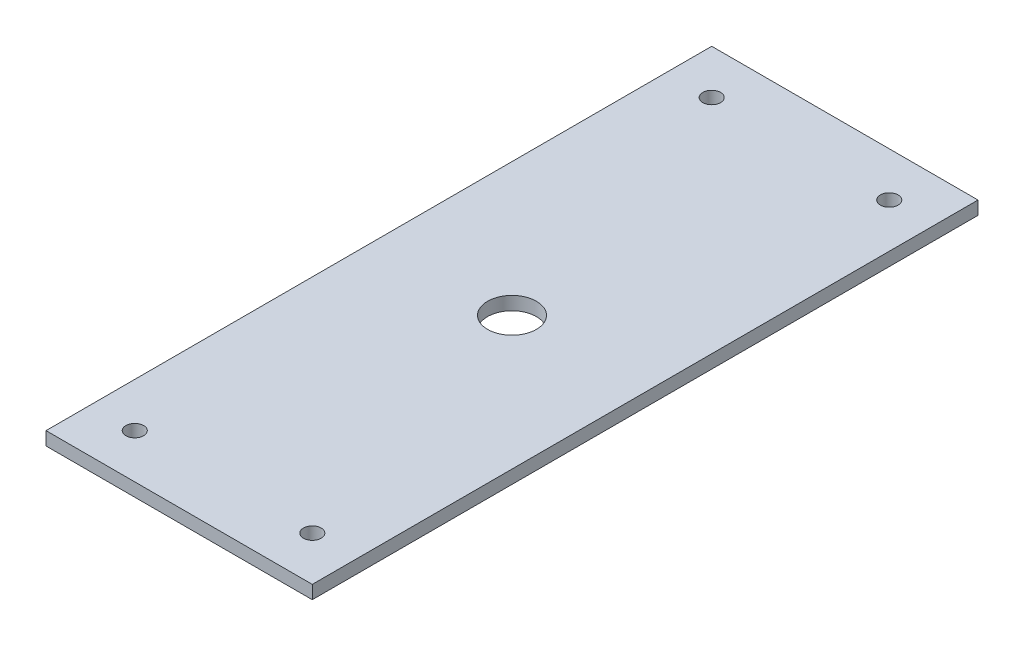
ISO-10303-21;
HEADER;
FILE_DESCRIPTION(('STEP AP214'),'2;1');
FILE_NAME('part.step','',(''),(''),'','','');
FILE_SCHEMA(('AUTOMOTIVE_DESIGN { 1 0 10303 214 1 1 1 1 }'));
ENDSEC;
DATA;
#1=APPLICATION_CONTEXT('core data for automotive mechanical design processes');
#2=APPLICATION_PROTOCOL_DEFINITION('international standard','automotive_design',2000,#1);
#3=PRODUCT_CONTEXT('',#1,'mechanical');
#4=PRODUCT('Part','Part','',(#3));
#5=PRODUCT_RELATED_PRODUCT_CATEGORY('part','',(#4));
#6=PRODUCT_DEFINITION_FORMATION('','',#4);
#7=PRODUCT_DEFINITION_CONTEXT('part definition',#1,'design');
#8=PRODUCT_DEFINITION('design','',#6,#7);
#9=PRODUCT_DEFINITION_SHAPE('','',#8);
#10=(LENGTH_UNIT() NAMED_UNIT(*) SI_UNIT(.MILLI.,.METRE.));
#11=(NAMED_UNIT(*) PLANE_ANGLE_UNIT() SI_UNIT($,.RADIAN.));
#12=(NAMED_UNIT(*) SI_UNIT($,.STERADIAN.) SOLID_ANGLE_UNIT());
#13=UNCERTAINTY_MEASURE_WITH_UNIT(LENGTH_MEASURE(1.E-05),#10,'distance_accuracy_value','');
#14=(GEOMETRIC_REPRESENTATION_CONTEXT(3) GLOBAL_UNCERTAINTY_ASSIGNED_CONTEXT((#13)) GLOBAL_UNIT_ASSIGNED_CONTEXT((#10,
#11,#12)) REPRESENTATION_CONTEXT('',''));
#15=CARTESIAN_POINT('',(0.,0.,0.));
#16=DIRECTION('',(0.,0.,1.));
#17=DIRECTION('',(1.,0.,0.));
#18=AXIS2_PLACEMENT_3D('',#15,#16,#17);
#19=CARTESIAN_POINT('',(0.,6.,-150.));
#20=DIRECTION('',(0.,0.,1.));
#21=DIRECTION('',(1.,0.,0.));
#22=AXIS2_PLACEMENT_3D('',#19,#20,#21);
#23=PLANE('',#22);
#24=DIRECTION('',(-1.,0.,0.));
#25=VECTOR('',#24,1.);
#26=CARTESIAN_POINT('',(0.,0.,-150.));
#27=LINE('',#26,#25);
#28=CARTESIAN_POINT('',(60.,0.,-150.));
#29=VERTEX_POINT('',#28);
#30=CARTESIAN_POINT('',(-60.,0.,-150.));
#31=VERTEX_POINT('',#30);
#32=EDGE_CURVE('E118',#29,#31,#27,.T.);
#33=ORIENTED_EDGE('',*,*,#32,.T.);
#34=DIRECTION('',(0.,-1.,0.));
#35=VECTOR('',#34,1.);
#36=CARTESIAN_POINT('',(-60.,6.,-150.));
#37=LINE('',#36,#35);
#38=CARTESIAN_POINT('',(-60.,6.,-150.));
#39=VERTEX_POINT('',#38);
#40=EDGE_CURVE('E11',#39,#31,#37,.T.);
#41=ORIENTED_EDGE('',*,*,#40,.F.);
#42=DIRECTION('',(-1.,0.,0.));
#43=VECTOR('',#42,1.);
#44=CARTESIAN_POINT('',(0.,6.,-150.));
#45=LINE('',#44,#43);
#46=CARTESIAN_POINT('',(60.,6.,-150.));
#47=VERTEX_POINT('',#46);
#48=EDGE_CURVE('E89',#47,#39,#45,.T.);
#49=ORIENTED_EDGE('',*,*,#48,.F.);
#50=DIRECTION('',(0.,-1.,0.));
#51=VECTOR('',#50,1.);
#52=CARTESIAN_POINT('',(60.,6.,-150.));
#53=LINE('',#52,#51);
#54=EDGE_CURVE('E56',#47,#29,#53,.T.);
#55=ORIENTED_EDGE('',*,*,#54,.T.);
#56=EDGE_LOOP('',(#33,#41,#49,#55));
#57=FACE_BOUND('',#56,.T.);
#58=ADVANCED_FACE('F39',(#57),#23,.F.);
#59=CARTESIAN_POINT('',(-60.,6.,0.));
#60=DIRECTION('',(1.,0.,0.));
#61=DIRECTION('',(0.,0.,-1.));
#62=AXIS2_PLACEMENT_3D('',#59,#60,#61);
#63=PLANE('',#62);
#64=DIRECTION('',(0.,0.,1.));
#65=VECTOR('',#64,1.);
#66=CARTESIAN_POINT('',(-60.,0.,0.));
#67=LINE('',#66,#65);
#68=CARTESIAN_POINT('',(-60.,0.,150.));
#69=VERTEX_POINT('',#68);
#70=EDGE_CURVE('E94',#31,#69,#67,.T.);
#71=ORIENTED_EDGE('',*,*,#70,.T.);
#72=DIRECTION('',(0.,-1.,0.));
#73=VECTOR('',#72,1.);
#74=CARTESIAN_POINT('',(-60.,6.,150.));
#75=LINE('',#74,#73);
#76=CARTESIAN_POINT('',(-60.,6.,150.));
#77=VERTEX_POINT('',#76);
#78=EDGE_CURVE('E48',#77,#69,#75,.T.);
#79=ORIENTED_EDGE('',*,*,#78,.F.);
#80=DIRECTION('',(0.,0.,1.));
#81=VECTOR('',#80,1.);
#82=CARTESIAN_POINT('',(-60.,6.,0.));
#83=LINE('',#82,#81);
#84=EDGE_CURVE('E81',#39,#77,#83,.T.);
#85=ORIENTED_EDGE('',*,*,#84,.F.);
#86=ORIENTED_EDGE('',*,*,#40,.T.);
#87=EDGE_LOOP('',(#71,#79,#85,#86));
#88=FACE_BOUND('',#87,.T.);
#89=ADVANCED_FACE('F93',(#88),#63,.F.);
#90=CARTESIAN_POINT('',(0.,6.,150.));
#91=DIRECTION('',(0.,0.,1.));
#92=DIRECTION('',(1.,0.,0.));
#93=AXIS2_PLACEMENT_3D('',#90,#91,#92);
#94=PLANE('',#93);
#95=DIRECTION('',(-1.,0.,0.));
#96=VECTOR('',#95,1.);
#97=CARTESIAN_POINT('',(0.,0.,150.));
#98=LINE('',#97,#96);
#99=CARTESIAN_POINT('',(60.,0.,150.));
#100=VERTEX_POINT('',#99);
#101=EDGE_CURVE('E121',#100,#69,#98,.T.);
#102=ORIENTED_EDGE('',*,*,#101,.F.);
#103=DIRECTION('',(0.,-1.,0.));
#104=VECTOR('',#103,1.);
#105=CARTESIAN_POINT('',(60.,6.,150.));
#106=LINE('',#105,#104);
#107=CARTESIAN_POINT('',(60.,6.,150.));
#108=VERTEX_POINT('',#107);
#109=EDGE_CURVE('E70',#108,#100,#106,.T.);
#110=ORIENTED_EDGE('',*,*,#109,.F.);
#111=DIRECTION('',(-1.,0.,0.));
#112=VECTOR('',#111,1.);
#113=CARTESIAN_POINT('',(0.,6.,150.));
#114=LINE('',#113,#112);
#115=EDGE_CURVE('E88',#108,#77,#114,.T.);
#116=ORIENTED_EDGE('',*,*,#115,.T.);
#117=ORIENTED_EDGE('',*,*,#78,.T.);
#118=EDGE_LOOP('',(#102,#110,#116,#117));
#119=FACE_BOUND('',#118,.T.);
#120=ADVANCED_FACE('F97',(#119),#94,.T.);
#121=CARTESIAN_POINT('',(-40.,6.,-130.));
#122=DIRECTION('',(0.,-1.,0.));
#123=DIRECTION('',(0.,0.,-1.));
#124=AXIS2_PLACEMENT_3D('',#121,#122,#123);
#125=CYLINDRICAL_SURFACE('',#124,4.00000000000001);
#126=CARTESIAN_POINT('',(-40.,6.,-130.));
#127=DIRECTION('',(0.,1.,0.));
#128=DIRECTION('',(0.,0.,1.));
#129=AXIS2_PLACEMENT_3D('',#126,#127,#128);
#130=CIRCLE('',#129,4.00000000000001);
#131=CARTESIAN_POINT('',(-40.,6.,-126.));
#132=VERTEX_POINT('',#131);
#133=EDGE_CURVE('E143',#132,#132,#130,.T.);
#134=ORIENTED_EDGE('',*,*,#133,.T.);
#135=EDGE_LOOP('',(#134));
#136=FACE_BOUND('',#135,.T.);
#137=CARTESIAN_POINT('',(-40.,0.,-130.));
#138=DIRECTION('',(0.,1.,0.));
#139=DIRECTION('',(0.,0.,1.));
#140=AXIS2_PLACEMENT_3D('',#137,#138,#139);
#141=CIRCLE('',#140,4.00000000000001);
#142=CARTESIAN_POINT('',(-40.,0.,-126.));
#143=VERTEX_POINT('',#142);
#144=EDGE_CURVE('E115',#143,#143,#141,.T.);
#145=ORIENTED_EDGE('',*,*,#144,.F.);
#146=EDGE_LOOP('',(#145));
#147=FACE_BOUND('',#146,.T.);
#148=ADVANCED_FACE('F147',(#136,#147),#125,.F.);
#149=CARTESIAN_POINT('',(40.,6.,-130.));
#150=DIRECTION('',(0.,-1.,0.));
#151=DIRECTION('',(0.,0.,-1.));
#152=AXIS2_PLACEMENT_3D('',#149,#150,#151);
#153=CYLINDRICAL_SURFACE('',#152,4.00000000000001);
#154=CARTESIAN_POINT('',(40.,6.,-130.));
#155=DIRECTION('',(0.,1.,0.));
#156=DIRECTION('',(0.,0.,1.));
#157=AXIS2_PLACEMENT_3D('',#154,#155,#156);
#158=CIRCLE('',#157,4.00000000000001);
#159=CARTESIAN_POINT('',(40.,6.,-126.));
#160=VERTEX_POINT('',#159);
#161=EDGE_CURVE('E140',#160,#160,#158,.T.);
#162=ORIENTED_EDGE('',*,*,#161,.T.);
#163=EDGE_LOOP('',(#162));
#164=FACE_BOUND('',#163,.T.);
#165=CARTESIAN_POINT('',(40.,0.,-130.));
#166=DIRECTION('',(0.,1.,0.));
#167=DIRECTION('',(0.,0.,1.));
#168=AXIS2_PLACEMENT_3D('',#165,#166,#167);
#169=CIRCLE('',#168,4.00000000000001);
#170=CARTESIAN_POINT('',(40.,0.,-126.));
#171=VERTEX_POINT('',#170);
#172=EDGE_CURVE('E112',#171,#171,#169,.T.);
#173=ORIENTED_EDGE('',*,*,#172,.F.);
#174=EDGE_LOOP('',(#173));
#175=FACE_BOUND('',#174,.T.);
#176=ADVANCED_FACE('F173',(#164,#175),#153,.F.);
#177=CARTESIAN_POINT('',(-40.,6.,130.));
#178=DIRECTION('',(0.,-1.,0.));
#179=DIRECTION('',(0.,0.,-1.));
#180=AXIS2_PLACEMENT_3D('',#177,#178,#179);
#181=CYLINDRICAL_SURFACE('',#180,4.00000000000001);
#182=CARTESIAN_POINT('',(-40.,6.,130.));
#183=DIRECTION('',(0.,1.,0.));
#184=DIRECTION('',(0.,0.,1.));
#185=AXIS2_PLACEMENT_3D('',#182,#183,#184);
#186=CIRCLE('',#185,4.00000000000001);
#187=CARTESIAN_POINT('',(-40.,6.,134.));
#188=VERTEX_POINT('',#187);
#189=EDGE_CURVE('E135',#188,#188,#186,.T.);
#190=ORIENTED_EDGE('',*,*,#189,.T.);
#191=EDGE_LOOP('',(#190));
#192=FACE_BOUND('',#191,.T.);
#193=CARTESIAN_POINT('',(-40.,0.,130.));
#194=DIRECTION('',(0.,1.,0.));
#195=DIRECTION('',(0.,0.,1.));
#196=AXIS2_PLACEMENT_3D('',#193,#194,#195);
#197=CIRCLE('',#196,4.00000000000001);
#198=CARTESIAN_POINT('',(-40.,0.,134.));
#199=VERTEX_POINT('',#198);
#200=EDGE_CURVE('E109',#199,#199,#197,.T.);
#201=ORIENTED_EDGE('',*,*,#200,.F.);
#202=EDGE_LOOP('',(#201));
#203=FACE_BOUND('',#202,.T.);
#204=ADVANCED_FACE('F176',(#192,#203),#181,.F.);
#205=CARTESIAN_POINT('',(40.,6.,130.));
#206=DIRECTION('',(0.,-1.,0.));
#207=DIRECTION('',(0.,0.,-1.));
#208=AXIS2_PLACEMENT_3D('',#205,#206,#207);
#209=CYLINDRICAL_SURFACE('',#208,4.00000000000001);
#210=CARTESIAN_POINT('',(40.,6.,130.));
#211=DIRECTION('',(0.,1.,0.));
#212=DIRECTION('',(0.,0.,1.));
#213=AXIS2_PLACEMENT_3D('',#210,#211,#212);
#214=CIRCLE('',#213,4.00000000000001);
#215=CARTESIAN_POINT('',(40.,6.,134.));
#216=VERTEX_POINT('',#215);
#217=EDGE_CURVE('E130',#216,#216,#214,.T.);
#218=ORIENTED_EDGE('',*,*,#217,.T.);
#219=EDGE_LOOP('',(#218));
#220=FACE_BOUND('',#219,.T.);
#221=CARTESIAN_POINT('',(40.,0.,130.));
#222=DIRECTION('',(0.,1.,0.));
#223=DIRECTION('',(0.,0.,1.));
#224=AXIS2_PLACEMENT_3D('',#221,#222,#223);
#225=CIRCLE('',#224,4.00000000000001);
#226=CARTESIAN_POINT('',(40.,0.,134.));
#227=VERTEX_POINT('',#226);
#228=EDGE_CURVE('E106',#227,#227,#225,.T.);
#229=ORIENTED_EDGE('',*,*,#228,.F.);
#230=EDGE_LOOP('',(#229));
#231=FACE_BOUND('',#230,.T.);
#232=ADVANCED_FACE('F179',(#220,#231),#209,.F.);
#233=CARTESIAN_POINT('',(0.,6.,1.11022302462516E-13));
#234=DIRECTION('',(0.,-1.,0.));
#235=DIRECTION('',(0.,0.,-1.));
#236=AXIS2_PLACEMENT_3D('',#233,#234,#235);
#237=CYLINDRICAL_SURFACE('',#236,11.);
#238=CARTESIAN_POINT('',(0.,6.,1.11022302462516E-13));
#239=DIRECTION('',(0.,1.,0.));
#240=DIRECTION('',(0.,0.,1.));
#241=AXIS2_PLACEMENT_3D('',#238,#239,#240);
#242=CIRCLE('',#241,11.);
#243=CARTESIAN_POINT('',(0.,6.,11.0000000000001));
#244=VERTEX_POINT('',#243);
#245=EDGE_CURVE('E126',#244,#244,#242,.T.);
#246=ORIENTED_EDGE('',*,*,#245,.T.);
#247=EDGE_LOOP('',(#246));
#248=FACE_BOUND('',#247,.T.);
#249=CARTESIAN_POINT('',(0.,0.,1.11022302462516E-13));
#250=DIRECTION('',(0.,1.,0.));
#251=DIRECTION('',(0.,0.,1.));
#252=AXIS2_PLACEMENT_3D('',#249,#250,#251);
#253=CIRCLE('',#252,11.);
#254=CARTESIAN_POINT('',(0.,0.,11.0000000000001));
#255=VERTEX_POINT('',#254);
#256=EDGE_CURVE('E103',#255,#255,#253,.T.);
#257=ORIENTED_EDGE('',*,*,#256,.F.);
#258=EDGE_LOOP('',(#257));
#259=FACE_BOUND('',#258,.T.);
#260=ADVANCED_FACE('F41',(#248,#259),#237,.F.);
#261=CARTESIAN_POINT('',(60.,6.,0.));
#262=DIRECTION('',(1.,0.,0.));
#263=DIRECTION('',(0.,0.,-1.));
#264=AXIS2_PLACEMENT_3D('',#261,#262,#263);
#265=PLANE('',#264);
#266=DIRECTION('',(0.,0.,1.));
#267=VECTOR('',#266,1.);
#268=CARTESIAN_POINT('',(60.,0.,0.));
#269=LINE('',#268,#267);
#270=EDGE_CURVE('E123',#29,#100,#269,.T.);
#271=ORIENTED_EDGE('',*,*,#270,.F.);
#272=ORIENTED_EDGE('',*,*,#54,.F.);
#273=DIRECTION('',(0.,0.,1.));
#274=VECTOR('',#273,1.);
#275=CARTESIAN_POINT('',(60.,6.,0.));
#276=LINE('',#275,#274);
#277=EDGE_CURVE('E98',#47,#108,#276,.T.);
#278=ORIENTED_EDGE('',*,*,#277,.T.);
#279=ORIENTED_EDGE('',*,*,#109,.T.);
#280=EDGE_LOOP('',(#271,#272,#278,#279));
#281=FACE_BOUND('',#280,.T.);
#282=ADVANCED_FACE('F152',(#281),#265,.T.);
#283=CARTESIAN_POINT('',(0.,6.,0.));
#284=DIRECTION('',(0.,1.,0.));
#285=DIRECTION('',(0.,0.,1.));
#286=AXIS2_PLACEMENT_3D('',#283,#284,#285);
#287=PLANE('',#286);
#288=ORIENTED_EDGE('',*,*,#245,.F.);
#289=EDGE_LOOP('',(#288));
#290=FACE_BOUND('',#289,.T.);
#291=ORIENTED_EDGE('',*,*,#217,.F.);
#292=EDGE_LOOP('',(#291));
#293=FACE_BOUND('',#292,.T.);
#294=ORIENTED_EDGE('',*,*,#189,.F.);
#295=EDGE_LOOP('',(#294));
#296=FACE_BOUND('',#295,.T.);
#297=ORIENTED_EDGE('',*,*,#161,.F.);
#298=EDGE_LOOP('',(#297));
#299=FACE_BOUND('',#298,.T.);
#300=ORIENTED_EDGE('',*,*,#133,.F.);
#301=EDGE_LOOP('',(#300));
#302=FACE_BOUND('',#301,.T.);
#303=ORIENTED_EDGE('',*,*,#48,.T.);
#304=ORIENTED_EDGE('',*,*,#84,.T.);
#305=ORIENTED_EDGE('',*,*,#115,.F.);
#306=ORIENTED_EDGE('',*,*,#277,.F.);
#307=EDGE_LOOP('',(#303,#304,#305,#306));
#308=FACE_BOUND('',#307,.T.);
#309=ADVANCED_FACE('F85',(#290,#293,#296,#299,#302,#308),#287,.T.);
#310=CARTESIAN_POINT('',(0.,0.,0.));
#311=DIRECTION('',(0.,1.,0.));
#312=DIRECTION('',(0.,0.,1.));
#313=AXIS2_PLACEMENT_3D('',#310,#311,#312);
#314=PLANE('',#313);
#315=ORIENTED_EDGE('',*,*,#256,.T.);
#316=EDGE_LOOP('',(#315));
#317=FACE_BOUND('',#316,.T.);
#318=ORIENTED_EDGE('',*,*,#228,.T.);
#319=EDGE_LOOP('',(#318));
#320=FACE_BOUND('',#319,.T.);
#321=ORIENTED_EDGE('',*,*,#200,.T.);
#322=EDGE_LOOP('',(#321));
#323=FACE_BOUND('',#322,.T.);
#324=ORIENTED_EDGE('',*,*,#172,.T.);
#325=EDGE_LOOP('',(#324));
#326=FACE_BOUND('',#325,.T.);
#327=ORIENTED_EDGE('',*,*,#144,.T.);
#328=EDGE_LOOP('',(#327));
#329=FACE_BOUND('',#328,.T.);
#330=ORIENTED_EDGE('',*,*,#32,.F.);
#331=ORIENTED_EDGE('',*,*,#270,.T.);
#332=ORIENTED_EDGE('',*,*,#101,.T.);
#333=ORIENTED_EDGE('',*,*,#70,.F.);
#334=EDGE_LOOP('',(#330,#331,#332,#333));
#335=FACE_BOUND('',#334,.T.);
#336=ADVANCED_FACE('F151',(#317,#320,#323,#326,#329,#335),#314,.F.);
#337=CLOSED_SHELL('',(#58,#89,#120,#148,#176,#204,#232,#260,#282,#309,#336));
#338=MANIFOLD_SOLID_BREP('B2',#337);
#339=ADVANCED_BREP_SHAPE_REPRESENTATION('',(#18,#338),#14);
#340=SHAPE_DEFINITION_REPRESENTATION(#9,#339);
ENDSEC;
END-ISO-10303-21;
